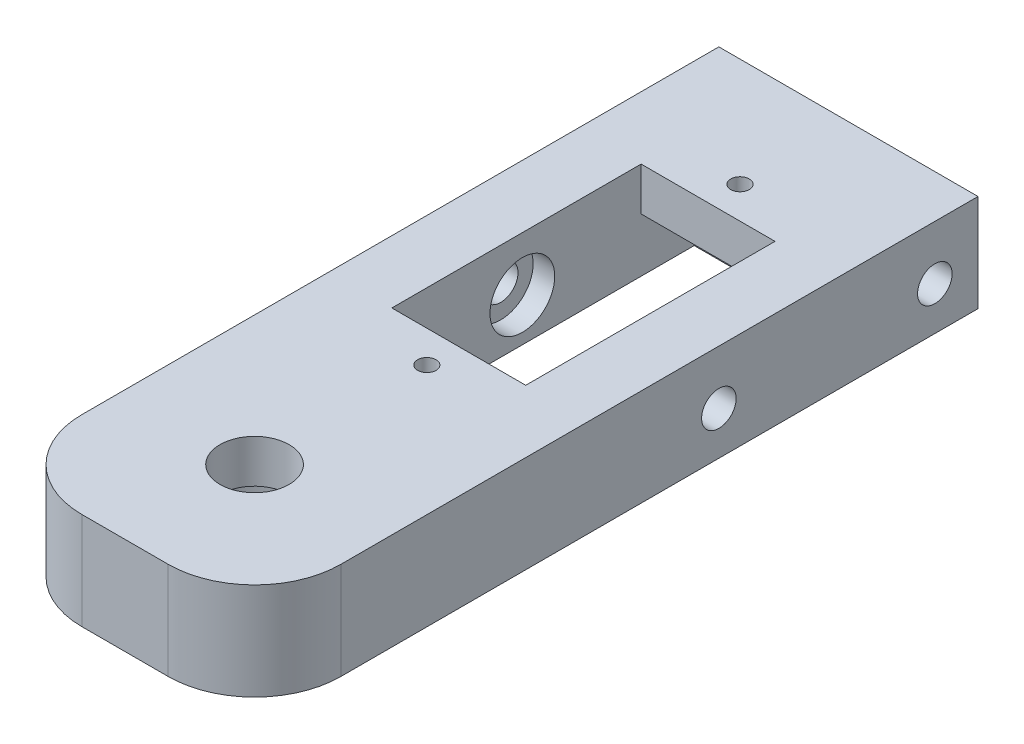
ISO-10303-21;
HEADER;
FILE_DESCRIPTION(('STEP AP214'),'2;1');
FILE_NAME('part.step','',(''),(''),'','','');
FILE_SCHEMA(('AUTOMOTIVE_DESIGN { 1 0 10303 214 1 1 1 1 }'));
ENDSEC;
DATA;
#1=APPLICATION_CONTEXT('core data for automotive mechanical design processes');
#2=APPLICATION_PROTOCOL_DEFINITION('international standard','automotive_design',2000,#1);
#3=PRODUCT_CONTEXT('',#1,'mechanical');
#4=PRODUCT('Part','Part','',(#3));
#5=PRODUCT_RELATED_PRODUCT_CATEGORY('part','',(#4));
#6=PRODUCT_DEFINITION_FORMATION('','',#4);
#7=PRODUCT_DEFINITION_CONTEXT('part definition',#1,'design');
#8=PRODUCT_DEFINITION('design','',#6,#7);
#9=PRODUCT_DEFINITION_SHAPE('','',#8);
#10=(LENGTH_UNIT() NAMED_UNIT(*) SI_UNIT(.MILLI.,.METRE.));
#11=(NAMED_UNIT(*) PLANE_ANGLE_UNIT() SI_UNIT($,.RADIAN.));
#12=(NAMED_UNIT(*) SI_UNIT($,.STERADIAN.) SOLID_ANGLE_UNIT());
#13=UNCERTAINTY_MEASURE_WITH_UNIT(LENGTH_MEASURE(1.E-05),#10,'distance_accuracy_value','');
#14=(GEOMETRIC_REPRESENTATION_CONTEXT(3) GLOBAL_UNCERTAINTY_ASSIGNED_CONTEXT((#13)) GLOBAL_UNIT_ASSIGNED_CONTEXT((#10,
#11,#12)) REPRESENTATION_CONTEXT('',''));
#15=CARTESIAN_POINT('',(0.,0.,0.));
#16=DIRECTION('',(0.,0.,1.));
#17=DIRECTION('',(1.,0.,0.));
#18=AXIS2_PLACEMENT_3D('',#15,#16,#17);
#19=CARTESIAN_POINT('',(-12.,0.,-31.0015722609013));
#20=DIRECTION('',(1.,0.,0.));
#21=DIRECTION('',(0.,0.,-1.));
#22=AXIS2_PLACEMENT_3D('',#19,#20,#21);
#23=CYLINDRICAL_SURFACE('',#22,1.60000000000001);
#24=CARTESIAN_POINT('',(12.,0.,-31.0015722609013));
#25=DIRECTION('',(1.,0.,0.));
#26=DIRECTION('',(0.,0.,-1.));
#27=AXIS2_PLACEMENT_3D('',#24,#25,#26);
#28=CIRCLE('',#27,1.60000000000001);
#29=CARTESIAN_POINT('',(12.,0.,-32.6015722609013));
#30=VERTEX_POINT('',#29);
#31=EDGE_CURVE('E262',#30,#30,#28,.T.);
#32=ORIENTED_EDGE('',*,*,#31,.T.);
#33=EDGE_LOOP('',(#32));
#34=FACE_BOUND('',#33,.T.);
#35=CARTESIAN_POINT('',(8.2,0.,-31.0015722609013));
#36=DIRECTION('',(-1.,0.,0.));
#37=DIRECTION('',(0.,0.,1.));
#38=AXIS2_PLACEMENT_3D('',#35,#36,#37);
#39=CIRCLE('',#38,1.60000000000001);
#40=CARTESIAN_POINT('',(8.2,0.,-29.4015722609013));
#41=VERTEX_POINT('',#40);
#42=EDGE_CURVE('E41',#41,#41,#39,.F.);
#43=ORIENTED_EDGE('',*,*,#42,.F.);
#44=EDGE_LOOP('',(#43));
#45=FACE_BOUND('',#44,.T.);
#46=ADVANCED_FACE('F37',(#34,#45),#23,.F.);
#47=CARTESIAN_POINT('',(-12.,0.,-31.0015722609013));
#48=DIRECTION('',(1.,0.,0.));
#49=DIRECTION('',(0.,0.,-1.));
#50=AXIS2_PLACEMENT_3D('',#47,#48,#49);
#51=CIRCLE('',#50,1.60000000000001);
#52=CARTESIAN_POINT('',(-12.,0.,-32.6015722609013));
#53=VERTEX_POINT('',#52);
#54=EDGE_CURVE('E267',#53,#53,#51,.T.);
#55=ORIENTED_EDGE('',*,*,#54,.F.);
#56=EDGE_LOOP('',(#55));
#57=FACE_BOUND('',#56,.T.);
#58=CARTESIAN_POINT('',(-8.2,0.,-31.0015722609013));
#59=DIRECTION('',(1.,0.,0.));
#60=DIRECTION('',(0.,0.,-1.));
#61=AXIS2_PLACEMENT_3D('',#58,#59,#60);
#62=CIRCLE('',#61,1.60000000000001);
#63=CARTESIAN_POINT('',(-8.2,0.,-32.6015722609013));
#64=VERTEX_POINT('',#63);
#65=EDGE_CURVE('E260',#64,#64,#62,.F.);
#66=ORIENTED_EDGE('',*,*,#65,.F.);
#67=EDGE_LOOP('',(#66));
#68=FACE_BOUND('',#67,.T.);
#69=ADVANCED_FACE('F339',(#57,#68),#23,.F.);
#70=CARTESIAN_POINT('',(6.2,-4.,-42.));
#71=DIRECTION('',(0.,0.,-1.));
#72=DIRECTION('',(0.,1.,0.));
#73=AXIS2_PLACEMENT_3D('',#70,#71,#72);
#74=PLANE('',#73);
#75=DIRECTION('',(-1.,0.,0.));
#76=VECTOR('',#75,1.);
#77=CARTESIAN_POINT('',(6.2,1.00000000000001,-42.));
#78=LINE('',#77,#76);
#79=CARTESIAN_POINT('',(6.2,1.00000000000001,-42.));
#80=VERTEX_POINT('',#79);
#81=CARTESIAN_POINT('',(-6.2,1.00000000000001,-42.));
#82=VERTEX_POINT('',#81);
#83=EDGE_CURVE('E189',#80,#82,#78,.T.);
#84=ORIENTED_EDGE('',*,*,#83,.F.);
#85=DIRECTION('',(0.,1.,0.));
#86=VECTOR('',#85,1.);
#87=CARTESIAN_POINT('',(6.2,-4.,-42.));
#88=LINE('',#87,#86);
#89=CARTESIAN_POINT('',(6.2,5.00000000000001,-42.));
#90=VERTEX_POINT('',#89);
#91=EDGE_CURVE('E207',#80,#90,#88,.T.);
#92=ORIENTED_EDGE('',*,*,#91,.T.);
#93=DIRECTION('',(-1.,0.,0.));
#94=VECTOR('',#93,1.);
#95=CARTESIAN_POINT('',(6.2,5.00000000000001,-42.));
#96=LINE('',#95,#94);
#97=CARTESIAN_POINT('',(-6.2,5.00000000000001,-42.));
#98=VERTEX_POINT('',#97);
#99=EDGE_CURVE('E156',#90,#98,#96,.T.);
#100=ORIENTED_EDGE('',*,*,#99,.T.);
#101=DIRECTION('',(0.,1.,0.));
#102=VECTOR('',#101,1.);
#103=CARTESIAN_POINT('',(-6.2,-4.,-42.));
#104=LINE('',#103,#102);
#105=EDGE_CURVE('E204',#82,#98,#104,.T.);
#106=ORIENTED_EDGE('',*,*,#105,.F.);
#107=EDGE_LOOP('',(#84,#92,#100,#106));
#108=FACE_BOUND('',#107,.T.);
#109=ADVANCED_FACE('F308',(#108),#74,.F.);
#110=CARTESIAN_POINT('',(6.2,-4.00000000000001,-18.9147427120666));
#111=DIRECTION('',(0.,0.,1.));
#112=DIRECTION('',(0.,-1.,0.));
#113=AXIS2_PLACEMENT_3D('',#110,#111,#112);
#114=PLANE('',#113);
#115=DIRECTION('',(1.,0.,0.));
#116=VECTOR('',#115,1.);
#117=CARTESIAN_POINT('',(6.2,1.00000000000001,-18.9147427120666));
#118=LINE('',#117,#116);
#119=CARTESIAN_POINT('',(-6.2,1.00000000000001,-18.9147427120666));
#120=VERTEX_POINT('',#119);
#121=CARTESIAN_POINT('',(6.2,1.,-18.9147427120666));
#122=VERTEX_POINT('',#121);
#123=EDGE_CURVE('E247',#120,#122,#118,.T.);
#124=ORIENTED_EDGE('',*,*,#123,.F.);
#125=DIRECTION('',(0.,1.,0.));
#126=VECTOR('',#125,1.);
#127=CARTESIAN_POINT('',(-6.2,-4.00000000000001,-18.9147427120666));
#128=LINE('',#127,#126);
#129=CARTESIAN_POINT('',(-6.19999999999999,5.00000000000001,-18.9147427120666));
#130=VERTEX_POINT('',#129);
#131=EDGE_CURVE('E193',#120,#130,#128,.T.);
#132=ORIENTED_EDGE('',*,*,#131,.T.);
#133=DIRECTION('',(1.,0.,0.));
#134=VECTOR('',#133,1.);
#135=CARTESIAN_POINT('',(6.2,5.,-18.9147427120666));
#136=LINE('',#135,#134);
#137=CARTESIAN_POINT('',(6.2,5.,-18.9147427120666));
#138=VERTEX_POINT('',#137);
#139=EDGE_CURVE('E196',#130,#138,#136,.T.);
#140=ORIENTED_EDGE('',*,*,#139,.T.);
#141=DIRECTION('',(0.,1.,0.));
#142=VECTOR('',#141,1.);
#143=CARTESIAN_POINT('',(6.2,-4.00000000000001,-18.9147427120666));
#144=LINE('',#143,#142);
#145=EDGE_CURVE('E209',#122,#138,#144,.T.);
#146=ORIENTED_EDGE('',*,*,#145,.F.);
#147=EDGE_LOOP('',(#124,#132,#140,#146));
#148=FACE_BOUND('',#147,.T.);
#149=ADVANCED_FACE('F319',(#148),#114,.F.);
#150=CARTESIAN_POINT('',(12.,-4.,12.));
#151=DIRECTION('',(0.,0.,-1.));
#152=DIRECTION('',(0.,1.,0.));
#153=AXIS2_PLACEMENT_3D('',#150,#151,#152);
#154=PLANE('',#153);
#155=DIRECTION('',(-1.,0.,0.));
#156=VECTOR('',#155,1.);
#157=CARTESIAN_POINT('',(12.,5.,12.));
#158=LINE('',#157,#156);
#159=CARTESIAN_POINT('',(4.,5.,12.));
#160=VERTEX_POINT('',#159);
#161=CARTESIAN_POINT('',(-4.,5.,12.));
#162=VERTEX_POINT('',#161);
#163=EDGE_CURVE('E231',#160,#162,#158,.T.);
#164=ORIENTED_EDGE('',*,*,#163,.T.);
#165=DIRECTION('',(0.,-1.,0.));
#166=VECTOR('',#165,1.);
#167=CARTESIAN_POINT('',(-4.,-4.,12.));
#168=LINE('',#167,#166);
#169=CARTESIAN_POINT('',(-4.,-4.,12.));
#170=VERTEX_POINT('',#169);
#171=EDGE_CURVE('E251',#162,#170,#168,.T.);
#172=ORIENTED_EDGE('',*,*,#171,.T.);
#173=DIRECTION('',(-1.,0.,0.));
#174=VECTOR('',#173,1.);
#175=CARTESIAN_POINT('',(12.,-4.,12.));
#176=LINE('',#175,#174);
#177=CARTESIAN_POINT('',(4.,-4.,12.));
#178=VERTEX_POINT('',#177);
#179=EDGE_CURVE('E244',#178,#170,#176,.T.);
#180=ORIENTED_EDGE('',*,*,#179,.F.);
#181=DIRECTION('',(0.,-1.,0.));
#182=VECTOR('',#181,1.);
#183=CARTESIAN_POINT('',(4.,5.,12.));
#184=LINE('',#183,#182);
#185=EDGE_CURVE('E249',#178,#160,#184,.F.);
#186=ORIENTED_EDGE('',*,*,#185,.T.);
#187=EDGE_LOOP('',(#164,#172,#180,#186));
#188=FACE_BOUND('',#187,.T.);
#189=ADVANCED_FACE('F384',(#188),#154,.F.);
#190=CARTESIAN_POINT('',(12.,-3.99999999999999,-55.));
#191=DIRECTION('',(0.,1.,0.));
#192=DIRECTION('',(0.,0.,1.));
#193=AXIS2_PLACEMENT_3D('',#190,#191,#192);
#194=PLANE('',#193);
#195=DIRECTION('',(0.,0.,1.));
#196=VECTOR('',#195,1.);
#197=CARTESIAN_POINT('',(-6.2,-4.,-42.));
#198=LINE('',#197,#196);
#199=CARTESIAN_POINT('',(-6.2,-3.99999999999999,-46.9147427120666));
#200=VERTEX_POINT('',#199);
#201=CARTESIAN_POINT('',(-6.2,-4.,-14.));
#202=VERTEX_POINT('',#201);
#203=EDGE_CURVE('E144',#200,#202,#198,.T.);
#204=ORIENTED_EDGE('',*,*,#203,.T.);
#205=DIRECTION('',(-1.,0.,0.));
#206=VECTOR('',#205,1.);
#207=CARTESIAN_POINT('',(6.2,-4.,-14.));
#208=LINE('',#207,#206);
#209=CARTESIAN_POINT('',(6.2,-4.,-14.));
#210=VERTEX_POINT('',#209);
#211=EDGE_CURVE('E167',#210,#202,#208,.T.);
#212=ORIENTED_EDGE('',*,*,#211,.F.);
#213=DIRECTION('',(0.,0.,-1.));
#214=VECTOR('',#213,1.);
#215=CARTESIAN_POINT('',(6.2,-4.,-42.));
#216=LINE('',#215,#214);
#217=CARTESIAN_POINT('',(6.2,-3.99999999999999,-46.9147427120666));
#218=VERTEX_POINT('',#217);
#219=EDGE_CURVE('E155',#210,#218,#216,.T.);
#220=ORIENTED_EDGE('',*,*,#219,.T.);
#221=DIRECTION('',(1.,0.,0.));
#222=VECTOR('',#221,1.);
#223=CARTESIAN_POINT('',(6.2,-3.99999999999999,-46.9147427120666));
#224=LINE('',#223,#222);
#225=EDGE_CURVE('E162',#200,#218,#224,.T.);
#226=ORIENTED_EDGE('',*,*,#225,.F.);
#227=EDGE_LOOP('',(#204,#212,#220,#226));
#228=FACE_BOUND('',#227,.T.);
#229=CARTESIAN_POINT('',(0.,-4.,0.));
#230=DIRECTION('',(0.,1.,0.));
#231=DIRECTION('',(0.,0.,1.));
#232=AXIS2_PLACEMENT_3D('',#229,#230,#231);
#233=CIRCLE('',#232,6.7);
#234=CARTESIAN_POINT('',(0.,-4.,6.7));
#235=VERTEX_POINT('',#234);
#236=EDGE_CURVE('E215',#235,#235,#233,.T.);
#237=ORIENTED_EDGE('',*,*,#236,.T.);
#238=EDGE_LOOP('',(#237));
#239=FACE_BOUND('',#238,.T.);
#240=ORIENTED_EDGE('',*,*,#179,.T.);
#241=CARTESIAN_POINT('',(-4.,-4.,4.));
#242=DIRECTION('',(0.,1.,0.));
#243=DIRECTION('',(0.,0.,1.));
#244=AXIS2_PLACEMENT_3D('',#241,#242,#243);
#245=CIRCLE('',#244,8.);
#246=CARTESIAN_POINT('',(-12.,-4.,4.));
#247=VERTEX_POINT('',#246);
#248=EDGE_CURVE('E256',#170,#247,#245,.F.);
#249=ORIENTED_EDGE('',*,*,#248,.T.);
#250=DIRECTION('',(0.,0.,-1.));
#251=VECTOR('',#250,1.);
#252=CARTESIAN_POINT('',(-12.,-3.99999999999999,-55.));
#253=LINE('',#252,#251);
#254=CARTESIAN_POINT('',(-12.,-3.99999999999999,-55.));
#255=VERTEX_POINT('',#254);
#256=EDGE_CURVE('E221',#247,#255,#253,.T.);
#257=ORIENTED_EDGE('',*,*,#256,.T.);
#258=DIRECTION('',(-1.,0.,0.));
#259=VECTOR('',#258,1.);
#260=CARTESIAN_POINT('',(12.,-3.99999999999999,-55.));
#261=LINE('',#260,#259);
#262=CARTESIAN_POINT('',(12.,-3.99999999999999,-55.));
#263=VERTEX_POINT('',#262);
#264=EDGE_CURVE('E241',#263,#255,#261,.T.);
#265=ORIENTED_EDGE('',*,*,#264,.F.);
#266=DIRECTION('',(0.,0.,-1.));
#267=VECTOR('',#266,1.);
#268=CARTESIAN_POINT('',(12.,-3.99999999999999,-55.));
#269=LINE('',#268,#267);
#270=CARTESIAN_POINT('',(12.,-4.,4.));
#271=VERTEX_POINT('',#270);
#272=EDGE_CURVE('E224',#271,#263,#269,.T.);
#273=ORIENTED_EDGE('',*,*,#272,.F.);
#274=CARTESIAN_POINT('',(4.,-4.,4.));
#275=DIRECTION('',(0.,1.,0.));
#276=DIRECTION('',(0.,0.,1.));
#277=AXIS2_PLACEMENT_3D('',#274,#275,#276);
#278=CIRCLE('',#277,8.);
#279=EDGE_CURVE('E254',#271,#178,#278,.F.);
#280=ORIENTED_EDGE('',*,*,#279,.T.);
#281=EDGE_LOOP('',(#240,#249,#257,#265,#273,#280));
#282=FACE_BOUND('',#281,.T.);
#283=ADVANCED_FACE('F169',(#228,#239,#282),#194,.F.);
#284=CARTESIAN_POINT('',(12.,-3.99999999999999,-55.));
#285=DIRECTION('',(0.,0.,1.));
#286=DIRECTION('',(1.,0.,0.));
#287=AXIS2_PLACEMENT_3D('',#284,#285,#286);
#288=PLANE('',#287);
#289=DIRECTION('',(0.,1.,0.));
#290=VECTOR('',#289,1.);
#291=CARTESIAN_POINT('',(-12.,-3.99999999999999,-55.));
#292=LINE('',#291,#290);
#293=CARTESIAN_POINT('',(-12.,5.00000000000001,-55.));
#294=VERTEX_POINT('',#293);
#295=EDGE_CURVE('E233',#255,#294,#292,.T.);
#296=ORIENTED_EDGE('',*,*,#295,.T.);
#297=DIRECTION('',(-1.,0.,0.));
#298=VECTOR('',#297,1.);
#299=CARTESIAN_POINT('',(12.,5.00000000000001,-55.));
#300=LINE('',#299,#298);
#301=CARTESIAN_POINT('',(12.,5.00000000000001,-55.));
#302=VERTEX_POINT('',#301);
#303=EDGE_CURVE('E238',#302,#294,#300,.T.);
#304=ORIENTED_EDGE('',*,*,#303,.F.);
#305=DIRECTION('',(0.,1.,0.));
#306=VECTOR('',#305,1.);
#307=CARTESIAN_POINT('',(12.,-3.99999999999999,-55.));
#308=LINE('',#307,#306);
#309=EDGE_CURVE('E226',#263,#302,#308,.T.);
#310=ORIENTED_EDGE('',*,*,#309,.F.);
#311=ORIENTED_EDGE('',*,*,#264,.T.);
#312=EDGE_LOOP('',(#296,#304,#310,#311));
#313=FACE_BOUND('',#312,.T.);
#314=ADVANCED_FACE('F368',(#313),#288,.F.);
#315=CARTESIAN_POINT('',(12.,5.00000000000001,-55.));
#316=DIRECTION('',(0.,-1.,0.));
#317=DIRECTION('',(0.,0.,-1.));
#318=AXIS2_PLACEMENT_3D('',#315,#316,#317);
#319=PLANE('',#318);
#320=CARTESIAN_POINT('',(0.,5.00000000000002,-15.9573713560333));
#321=DIRECTION('',(0.,-1.,0.));
#322=DIRECTION('',(0.,0.,-1.));
#323=AXIS2_PLACEMENT_3D('',#320,#321,#322);
#324=CIRCLE('',#323,0.855484328760497);
#325=CARTESIAN_POINT('',(0.,5.00000000000002,-16.8128556847938));
#326=VERTEX_POINT('',#325);
#327=EDGE_CURVE('E172',#326,#326,#324,.T.);
#328=ORIENTED_EDGE('',*,*,#327,.T.);
#329=EDGE_LOOP('',(#328));
#330=FACE_BOUND('',#329,.T.);
#331=CARTESIAN_POINT('',(0.,5.00000000000002,-44.9573713560333));
#332=DIRECTION('',(0.,-1.,0.));
#333=DIRECTION('',(0.,0.,1.));
#334=AXIS2_PLACEMENT_3D('',#331,#332,#333);
#335=CIRCLE('',#334,0.855484328760494);
#336=CARTESIAN_POINT('',(0.,5.00000000000002,-44.1018870272728));
#337=VERTEX_POINT('',#336);
#338=EDGE_CURVE('E291',#337,#337,#335,.T.);
#339=ORIENTED_EDGE('',*,*,#338,.T.);
#340=EDGE_LOOP('',(#339));
#341=FACE_BOUND('',#340,.T.);
#342=ORIENTED_EDGE('',*,*,#139,.F.);
#343=DIRECTION('',(0.,0.,1.));
#344=VECTOR('',#343,1.);
#345=CARTESIAN_POINT('',(-6.2,5.00000000000001,-42.));
#346=LINE('',#345,#344);
#347=EDGE_CURVE('E190',#98,#130,#346,.T.);
#348=ORIENTED_EDGE('',*,*,#347,.F.);
#349=ORIENTED_EDGE('',*,*,#99,.F.);
#350=DIRECTION('',(0.,0.,-1.));
#351=VECTOR('',#350,1.);
#352=CARTESIAN_POINT('',(6.2,5.00000000000001,-42.));
#353=LINE('',#352,#351);
#354=EDGE_CURVE('E199',#138,#90,#353,.T.);
#355=ORIENTED_EDGE('',*,*,#354,.F.);
#356=EDGE_LOOP('',(#342,#348,#349,#355));
#357=FACE_BOUND('',#356,.T.);
#358=CARTESIAN_POINT('',(0.,5.00000000000001,0.));
#359=DIRECTION('',(0.,-1.,0.));
#360=DIRECTION('',(0.,0.,-1.));
#361=AXIS2_PLACEMENT_3D('',#358,#359,#360);
#362=CIRCLE('',#361,3.2);
#363=CARTESIAN_POINT('',(0.,5.00000000000001,-3.2));
#364=VERTEX_POINT('',#363);
#365=EDGE_CURVE('E212',#364,#364,#362,.T.);
#366=ORIENTED_EDGE('',*,*,#365,.T.);
#367=EDGE_LOOP('',(#366));
#368=FACE_BOUND('',#367,.T.);
#369=DIRECTION('',(0.,0.,1.));
#370=VECTOR('',#369,1.);
#371=CARTESIAN_POINT('',(-12.,5.00000000000001,-55.));
#372=LINE('',#371,#370);
#373=CARTESIAN_POINT('',(-12.,5.,4.));
#374=VERTEX_POINT('',#373);
#375=EDGE_CURVE('E227',#294,#374,#372,.T.);
#376=ORIENTED_EDGE('',*,*,#375,.T.);
#377=CARTESIAN_POINT('',(-4.,5.,4.));
#378=DIRECTION('',(0.,-1.,0.));
#379=DIRECTION('',(0.,0.,-1.));
#380=AXIS2_PLACEMENT_3D('',#377,#378,#379);
#381=CIRCLE('',#380,8.);
#382=EDGE_CURVE('E46',#374,#162,#381,.F.);
#383=ORIENTED_EDGE('',*,*,#382,.T.);
#384=ORIENTED_EDGE('',*,*,#163,.F.);
#385=CARTESIAN_POINT('',(4.,5.,4.));
#386=DIRECTION('',(0.,-1.,0.));
#387=DIRECTION('',(0.,0.,-1.));
#388=AXIS2_PLACEMENT_3D('',#385,#386,#387);
#389=CIRCLE('',#388,8.);
#390=CARTESIAN_POINT('',(12.,5.,4.));
#391=VERTEX_POINT('',#390);
#392=EDGE_CURVE('E54',#160,#391,#389,.F.);
#393=ORIENTED_EDGE('',*,*,#392,.T.);
#394=DIRECTION('',(0.,0.,1.));
#395=VECTOR('',#394,1.);
#396=CARTESIAN_POINT('',(12.,5.00000000000001,-55.));
#397=LINE('',#396,#395);
#398=EDGE_CURVE('E229',#302,#391,#397,.T.);
#399=ORIENTED_EDGE('',*,*,#398,.F.);
#400=ORIENTED_EDGE('',*,*,#303,.T.);
#401=EDGE_LOOP('',(#376,#383,#384,#393,#399,#400));
#402=FACE_BOUND('',#401,.T.);
#403=ADVANCED_FACE('F315',(#330,#341,#357,#368,#402),#319,.F.);
#404=CARTESIAN_POINT('',(12.,0.,0.));
#405=DIRECTION('',(1.,0.,0.));
#406=DIRECTION('',(0.,0.,-1.));
#407=AXIS2_PLACEMENT_3D('',#404,#405,#406);
#408=PLANE('',#407);
#409=CARTESIAN_POINT('',(12.,0.,-51.0015722609013));
#410=DIRECTION('',(1.,0.,0.));
#411=DIRECTION('',(0.,0.,-1.));
#412=AXIS2_PLACEMENT_3D('',#409,#410,#411);
#413=CIRCLE('',#412,1.6);
#414=CARTESIAN_POINT('',(12.,0.,-52.6015722609013));
#415=VERTEX_POINT('',#414);
#416=EDGE_CURVE('E284',#415,#415,#413,.T.);
#417=ORIENTED_EDGE('',*,*,#416,.F.);
#418=EDGE_LOOP('',(#417));
#419=FACE_BOUND('',#418,.T.);
#420=ORIENTED_EDGE('',*,*,#31,.F.);
#421=EDGE_LOOP('',(#420));
#422=FACE_BOUND('',#421,.T.);
#423=ORIENTED_EDGE('',*,*,#398,.T.);
#424=DIRECTION('',(0.,-1.,0.));
#425=VECTOR('',#424,1.);
#426=CARTESIAN_POINT('',(12.,-4.,4.));
#427=LINE('',#426,#425);
#428=EDGE_CURVE('E12',#391,#271,#427,.T.);
#429=ORIENTED_EDGE('',*,*,#428,.T.);
#430=ORIENTED_EDGE('',*,*,#272,.T.);
#431=ORIENTED_EDGE('',*,*,#309,.T.);
#432=EDGE_LOOP('',(#423,#429,#430,#431));
#433=FACE_BOUND('',#432,.T.);
#434=ADVANCED_FACE('F367',(#419,#422,#433),#408,.T.);
#435=CARTESIAN_POINT('',(-12.,0.,0.));
#436=DIRECTION('',(1.,0.,0.));
#437=DIRECTION('',(0.,0.,-1.));
#438=AXIS2_PLACEMENT_3D('',#435,#436,#437);
#439=PLANE('',#438);
#440=CARTESIAN_POINT('',(-12.,0.,-51.0015722609013));
#441=DIRECTION('',(1.,0.,0.));
#442=DIRECTION('',(0.,0.,-1.));
#443=AXIS2_PLACEMENT_3D('',#440,#441,#442);
#444=CIRCLE('',#443,1.6);
#445=CARTESIAN_POINT('',(-12.,0.,-52.6015722609013));
#446=VERTEX_POINT('',#445);
#447=EDGE_CURVE('E280',#446,#446,#444,.T.);
#448=ORIENTED_EDGE('',*,*,#447,.T.);
#449=EDGE_LOOP('',(#448));
#450=FACE_BOUND('',#449,.T.);
#451=ORIENTED_EDGE('',*,*,#54,.T.);
#452=EDGE_LOOP('',(#451));
#453=FACE_BOUND('',#452,.T.);
#454=ORIENTED_EDGE('',*,*,#256,.F.);
#455=DIRECTION('',(0.,-1.,0.));
#456=VECTOR('',#455,1.);
#457=CARTESIAN_POINT('',(-12.,0.,4.));
#458=LINE('',#457,#456);
#459=EDGE_CURVE('E62',#247,#374,#458,.F.);
#460=ORIENTED_EDGE('',*,*,#459,.T.);
#461=ORIENTED_EDGE('',*,*,#375,.F.);
#462=ORIENTED_EDGE('',*,*,#295,.F.);
#463=EDGE_LOOP('',(#454,#460,#461,#462));
#464=FACE_BOUND('',#463,.T.);
#465=ADVANCED_FACE('F375',(#450,#453,#464),#439,.F.);
#466=CARTESIAN_POINT('',(0.,1.,0.));
#467=DIRECTION('',(0.,-1.,0.));
#468=DIRECTION('',(0.,0.,-1.));
#469=AXIS2_PLACEMENT_3D('',#466,#467,#468);
#470=CYLINDRICAL_SURFACE('',#469,6.7);
#471=CARTESIAN_POINT('',(0.,1.,0.));
#472=DIRECTION('',(0.,1.,0.));
#473=DIRECTION('',(0.,0.,1.));
#474=AXIS2_PLACEMENT_3D('',#471,#472,#473);
#475=CIRCLE('',#474,6.7);
#476=CARTESIAN_POINT('',(0.,1.,6.7));
#477=VERTEX_POINT('',#476);
#478=EDGE_CURVE('E218',#477,#477,#475,.T.);
#479=ORIENTED_EDGE('',*,*,#478,.T.);
#480=EDGE_LOOP('',(#479));
#481=FACE_BOUND('',#480,.T.);
#482=ORIENTED_EDGE('',*,*,#236,.F.);
#483=EDGE_LOOP('',(#482));
#484=FACE_BOUND('',#483,.T.);
#485=ADVANCED_FACE('F406',(#481,#484),#470,.F.);
#486=CARTESIAN_POINT('',(0.,1.,0.));
#487=DIRECTION('',(0.,1.,0.));
#488=DIRECTION('',(0.,0.,1.));
#489=AXIS2_PLACEMENT_3D('',#486,#487,#488);
#490=PLANE('',#489);
#491=CARTESIAN_POINT('',(0.,1.,0.));
#492=DIRECTION('',(0.,-1.,0.));
#493=DIRECTION('',(0.,0.,-1.));
#494=AXIS2_PLACEMENT_3D('',#491,#492,#493);
#495=CIRCLE('',#494,3.2);
#496=CARTESIAN_POINT('',(0.,1.,-3.2));
#497=VERTEX_POINT('',#496);
#498=EDGE_CURVE('E206',#497,#497,#495,.T.);
#499=ORIENTED_EDGE('',*,*,#498,.F.);
#500=EDGE_LOOP('',(#499));
#501=FACE_BOUND('',#500,.T.);
#502=ORIENTED_EDGE('',*,*,#478,.F.);
#503=EDGE_LOOP('',(#502));
#504=FACE_BOUND('',#503,.T.);
#505=ADVANCED_FACE('F411',(#501,#504),#490,.F.);
#506=CARTESIAN_POINT('',(0.,5.00000000000001,0.));
#507=DIRECTION('',(0.,-1.,0.));
#508=DIRECTION('',(0.,0.,-1.));
#509=AXIS2_PLACEMENT_3D('',#506,#507,#508);
#510=CYLINDRICAL_SURFACE('',#509,3.2);
#511=ORIENTED_EDGE('',*,*,#365,.F.);
#512=EDGE_LOOP('',(#511));
#513=FACE_BOUND('',#512,.T.);
#514=ORIENTED_EDGE('',*,*,#498,.T.);
#515=EDGE_LOOP('',(#514));
#516=FACE_BOUND('',#515,.T.);
#517=ADVANCED_FACE('F459',(#513,#516),#510,.F.);
#518=CARTESIAN_POINT('',(-6.2,-4.,-42.));
#519=DIRECTION('',(-1.,0.,0.));
#520=DIRECTION('',(0.,0.,1.));
#521=AXIS2_PLACEMENT_3D('',#518,#519,#520);
#522=PLANE('',#521);
#523=CARTESIAN_POINT('',(-6.2,0.,-31.0015722609013));
#524=DIRECTION('',(1.,0.,0.));
#525=DIRECTION('',(0.,0.,-1.));
#526=AXIS2_PLACEMENT_3D('',#523,#524,#525);
#527=CIRCLE('',#526,3.);
#528=CARTESIAN_POINT('',(-6.2,0.,-34.0015722609013));
#529=VERTEX_POINT('',#528);
#530=EDGE_CURVE('E270',#529,#529,#527,.T.);
#531=ORIENTED_EDGE('',*,*,#530,.F.);
#532=EDGE_LOOP('',(#531));
#533=FACE_BOUND('',#532,.T.);
#534=ORIENTED_EDGE('',*,*,#203,.F.);
#535=DIRECTION('',(0.,-1.,0.));
#536=VECTOR('',#535,1.);
#537=CARTESIAN_POINT('',(-6.2,40.1730051005248,-46.9147427120666));
#538=LINE('',#537,#536);
#539=CARTESIAN_POINT('',(-6.2,1.00000000000001,-46.9147427120666));
#540=VERTEX_POINT('',#539);
#541=EDGE_CURVE('E148',#540,#200,#538,.T.);
#542=ORIENTED_EDGE('',*,*,#541,.F.);
#543=DIRECTION('',(0.,0.,1.));
#544=VECTOR('',#543,1.);
#545=CARTESIAN_POINT('',(-6.2,1.00000000000001,-46.9147427120666));
#546=LINE('',#545,#544);
#547=EDGE_CURVE('E179',#540,#82,#546,.T.);
#548=ORIENTED_EDGE('',*,*,#547,.T.);
#549=ORIENTED_EDGE('',*,*,#105,.T.);
#550=ORIENTED_EDGE('',*,*,#347,.T.);
#551=ORIENTED_EDGE('',*,*,#131,.F.);
#552=CARTESIAN_POINT('',(-6.2,1.,-14.));
#553=VERTEX_POINT('',#552);
#554=EDGE_CURVE('E299',#120,#553,#546,.T.);
#555=ORIENTED_EDGE('',*,*,#554,.T.);
#556=DIRECTION('',(0.,-1.,0.));
#557=VECTOR('',#556,1.);
#558=CARTESIAN_POINT('',(-6.2,40.1730051005248,-14.));
#559=LINE('',#558,#557);
#560=EDGE_CURVE('E150',#553,#202,#559,.T.);
#561=ORIENTED_EDGE('',*,*,#560,.T.);
#562=EDGE_LOOP('',(#534,#542,#548,#549,#550,#551,#555,#561));
#563=FACE_BOUND('',#562,.T.);
#564=ADVANCED_FACE('F146',(#533,#563),#522,.F.);
#565=CARTESIAN_POINT('',(6.2,-4.,-42.));
#566=DIRECTION('',(1.,0.,0.));
#567=DIRECTION('',(0.,0.,-1.));
#568=AXIS2_PLACEMENT_3D('',#565,#566,#567);
#569=PLANE('',#568);
#570=CARTESIAN_POINT('',(6.2,0.,-31.0015722609013));
#571=DIRECTION('',(1.,0.,0.));
#572=DIRECTION('',(0.,0.,-1.));
#573=AXIS2_PLACEMENT_3D('',#570,#571,#572);
#574=CIRCLE('',#573,3.);
#575=CARTESIAN_POINT('',(6.2,0.,-34.0015722609013));
#576=VERTEX_POINT('',#575);
#577=EDGE_CURVE('E277',#576,#576,#574,.T.);
#578=ORIENTED_EDGE('',*,*,#577,.T.);
#579=EDGE_LOOP('',(#578));
#580=FACE_BOUND('',#579,.T.);
#581=ORIENTED_EDGE('',*,*,#219,.F.);
#582=DIRECTION('',(0.,-1.,0.));
#583=VECTOR('',#582,1.);
#584=CARTESIAN_POINT('',(6.2,40.1730051005248,-14.));
#585=LINE('',#584,#583);
#586=CARTESIAN_POINT('',(6.2,1.,-14.));
#587=VERTEX_POINT('',#586);
#588=EDGE_CURVE('E184',#587,#210,#585,.T.);
#589=ORIENTED_EDGE('',*,*,#588,.F.);
#590=DIRECTION('',(0.,0.,-1.));
#591=VECTOR('',#590,1.);
#592=CARTESIAN_POINT('',(6.2,1.00000000000001,-46.9147427120666));
#593=LINE('',#592,#591);
#594=EDGE_CURVE('E296',#587,#122,#593,.T.);
#595=ORIENTED_EDGE('',*,*,#594,.T.);
#596=ORIENTED_EDGE('',*,*,#145,.T.);
#597=ORIENTED_EDGE('',*,*,#354,.T.);
#598=ORIENTED_EDGE('',*,*,#91,.F.);
#599=CARTESIAN_POINT('',(6.2,1.00000000000001,-46.9147427120666));
#600=VERTEX_POINT('',#599);
#601=EDGE_CURVE('E183',#80,#600,#593,.T.);
#602=ORIENTED_EDGE('',*,*,#601,.T.);
#603=DIRECTION('',(0.,-1.,0.));
#604=VECTOR('',#603,1.);
#605=CARTESIAN_POINT('',(6.2,40.1730051005248,-46.9147427120666));
#606=LINE('',#605,#604);
#607=EDGE_CURVE('E166',#600,#218,#606,.T.);
#608=ORIENTED_EDGE('',*,*,#607,.T.);
#609=EDGE_LOOP('',(#581,#589,#595,#596,#597,#598,#602,#608));
#610=FACE_BOUND('',#609,.T.);
#611=ADVANCED_FACE('F325',(#580,#610),#569,.F.);
#612=CARTESIAN_POINT('',(12.,1.00000000000001,-55.));
#613=DIRECTION('',(0.,-1.,0.));
#614=DIRECTION('',(0.,0.,-1.));
#615=AXIS2_PLACEMENT_3D('',#612,#613,#614);
#616=PLANE('',#615);
#617=CARTESIAN_POINT('',(0.,1.,-15.9573713560333));
#618=DIRECTION('',(0.,-1.,0.));
#619=DIRECTION('',(0.,0.,-1.));
#620=AXIS2_PLACEMENT_3D('',#617,#618,#619);
#621=CIRCLE('',#620,0.855484328760497);
#622=CARTESIAN_POINT('',(0.,1.,-16.8128556847938));
#623=VERTEX_POINT('',#622);
#624=EDGE_CURVE('E176',#623,#623,#621,.T.);
#625=ORIENTED_EDGE('',*,*,#624,.F.);
#626=EDGE_LOOP('',(#625));
#627=FACE_BOUND('',#626,.T.);
#628=ORIENTED_EDGE('',*,*,#123,.T.);
#629=ORIENTED_EDGE('',*,*,#594,.F.);
#630=DIRECTION('',(1.,0.,0.));
#631=VECTOR('',#630,1.);
#632=CARTESIAN_POINT('',(6.2,1.,-14.));
#633=LINE('',#632,#631);
#634=EDGE_CURVE('E298',#553,#587,#633,.T.);
#635=ORIENTED_EDGE('',*,*,#634,.F.);
#636=ORIENTED_EDGE('',*,*,#554,.F.);
#637=EDGE_LOOP('',(#628,#629,#635,#636));
#638=FACE_BOUND('',#637,.T.);
#639=ADVANCED_FACE('F322',(#627,#638),#616,.T.);
#640=CARTESIAN_POINT('',(6.2,40.1730051005248,-14.));
#641=DIRECTION('',(0.,0.,1.));
#642=DIRECTION('',(0.,-1.,0.));
#643=AXIS2_PLACEMENT_3D('',#640,#641,#642);
#644=PLANE('',#643);
#645=ORIENTED_EDGE('',*,*,#634,.T.);
#646=ORIENTED_EDGE('',*,*,#588,.T.);
#647=ORIENTED_EDGE('',*,*,#211,.T.);
#648=ORIENTED_EDGE('',*,*,#560,.F.);
#649=EDGE_LOOP('',(#645,#646,#647,#648));
#650=FACE_BOUND('',#649,.T.);
#651=ADVANCED_FACE('F326',(#650),#644,.F.);
#652=CARTESIAN_POINT('',(0.,1.00000000000001,-44.9573713560333));
#653=DIRECTION('',(0.,-1.,0.));
#654=DIRECTION('',(0.,0.,1.));
#655=AXIS2_PLACEMENT_3D('',#652,#653,#654);
#656=CIRCLE('',#655,0.855484328760494);
#657=CARTESIAN_POINT('',(0.,1.00000000000001,-44.1018870272728));
#658=VERTEX_POINT('',#657);
#659=EDGE_CURVE('E283',#658,#658,#656,.T.);
#660=ORIENTED_EDGE('',*,*,#659,.F.);
#661=EDGE_LOOP('',(#660));
#662=FACE_BOUND('',#661,.T.);
#663=ORIENTED_EDGE('',*,*,#83,.T.);
#664=ORIENTED_EDGE('',*,*,#547,.F.);
#665=DIRECTION('',(-1.,0.,0.));
#666=VECTOR('',#665,1.);
#667=CARTESIAN_POINT('',(6.2,1.00000000000001,-46.9147427120666));
#668=LINE('',#667,#666);
#669=EDGE_CURVE('E164',#600,#540,#668,.T.);
#670=ORIENTED_EDGE('',*,*,#669,.F.);
#671=ORIENTED_EDGE('',*,*,#601,.F.);
#672=EDGE_LOOP('',(#663,#664,#670,#671));
#673=FACE_BOUND('',#672,.T.);
#674=ADVANCED_FACE('F328',(#662,#673),#616,.T.);
#675=CARTESIAN_POINT('',(6.2,40.1730051005248,-46.9147427120666));
#676=DIRECTION('',(0.,0.,-1.));
#677=DIRECTION('',(0.,1.,0.));
#678=AXIS2_PLACEMENT_3D('',#675,#676,#677);
#679=PLANE('',#678);
#680=ORIENTED_EDGE('',*,*,#669,.T.);
#681=ORIENTED_EDGE('',*,*,#541,.T.);
#682=ORIENTED_EDGE('',*,*,#225,.T.);
#683=ORIENTED_EDGE('',*,*,#607,.F.);
#684=EDGE_LOOP('',(#680,#681,#682,#683));
#685=FACE_BOUND('',#684,.T.);
#686=ADVANCED_FACE('F160',(#685),#679,.F.);
#687=CARTESIAN_POINT('',(0.,5.00000000000002,-44.9573713560333));
#688=DIRECTION('',(0.,-1.,0.));
#689=DIRECTION('',(0.,0.,-1.));
#690=AXIS2_PLACEMENT_3D('',#687,#688,#689);
#691=CYLINDRICAL_SURFACE('',#690,0.855484328760494);
#692=ORIENTED_EDGE('',*,*,#338,.F.);
#693=EDGE_LOOP('',(#692));
#694=FACE_BOUND('',#693,.T.);
#695=ORIENTED_EDGE('',*,*,#659,.T.);
#696=EDGE_LOOP('',(#695));
#697=FACE_BOUND('',#696,.T.);
#698=ADVANCED_FACE('F355',(#694,#697),#691,.F.);
#699=CARTESIAN_POINT('',(0.,5.00000000000002,-15.9573713560333));
#700=DIRECTION('',(0.,-1.,0.));
#701=DIRECTION('',(0.,0.,-1.));
#702=AXIS2_PLACEMENT_3D('',#699,#700,#701);
#703=CYLINDRICAL_SURFACE('',#702,0.855484328760497);
#704=ORIENTED_EDGE('',*,*,#327,.F.);
#705=EDGE_LOOP('',(#704));
#706=FACE_BOUND('',#705,.T.);
#707=ORIENTED_EDGE('',*,*,#624,.T.);
#708=EDGE_LOOP('',(#707));
#709=FACE_BOUND('',#708,.T.);
#710=ADVANCED_FACE('F351',(#706,#709),#703,.F.);
#711=CARTESIAN_POINT('',(-4.,-4.,4.));
#712=DIRECTION('',(0.,-1.,0.));
#713=DIRECTION('',(0.,0.,-1.));
#714=AXIS2_PLACEMENT_3D('',#711,#712,#713);
#715=CYLINDRICAL_SURFACE('',#714,8.);
#716=ORIENTED_EDGE('',*,*,#382,.F.);
#717=ORIENTED_EDGE('',*,*,#459,.F.);
#718=ORIENTED_EDGE('',*,*,#248,.F.);
#719=ORIENTED_EDGE('',*,*,#171,.F.);
#720=EDGE_LOOP('',(#716,#717,#718,#719));
#721=FACE_BOUND('',#720,.T.);
#722=ADVANCED_FACE('F354',(#721),#715,.T.);
#723=CARTESIAN_POINT('',(4.,0.,4.));
#724=DIRECTION('',(0.,1.,0.));
#725=DIRECTION('',(0.,0.,1.));
#726=AXIS2_PLACEMENT_3D('',#723,#724,#725);
#727=CYLINDRICAL_SURFACE('',#726,8.);
#728=ORIENTED_EDGE('',*,*,#392,.F.);
#729=ORIENTED_EDGE('',*,*,#185,.F.);
#730=ORIENTED_EDGE('',*,*,#279,.F.);
#731=ORIENTED_EDGE('',*,*,#428,.F.);
#732=EDGE_LOOP('',(#728,#729,#730,#731));
#733=FACE_BOUND('',#732,.T.);
#734=ADVANCED_FACE('F39',(#733),#727,.T.);
#735=CARTESIAN_POINT('',(-12.,0.,-51.0015722609013));
#736=DIRECTION('',(1.,0.,0.));
#737=DIRECTION('',(0.,0.,-1.));
#738=AXIS2_PLACEMENT_3D('',#735,#736,#737);
#739=CYLINDRICAL_SURFACE('',#738,1.6);
#740=ORIENTED_EDGE('',*,*,#447,.F.);
#741=EDGE_LOOP('',(#740));
#742=FACE_BOUND('',#741,.T.);
#743=ORIENTED_EDGE('',*,*,#416,.T.);
#744=EDGE_LOOP('',(#743));
#745=FACE_BOUND('',#744,.T.);
#746=ADVANCED_FACE('F349',(#742,#745),#739,.F.);
#747=CARTESIAN_POINT('',(-8.2,0.,-31.0015722609013));
#748=DIRECTION('',(1.,0.,0.));
#749=DIRECTION('',(0.,0.,-1.));
#750=AXIS2_PLACEMENT_3D('',#747,#748,#749);
#751=PLANE('',#750);
#752=CARTESIAN_POINT('',(-8.2,0.,-31.0015722609013));
#753=DIRECTION('',(1.,0.,0.));
#754=DIRECTION('',(0.,0.,-1.));
#755=AXIS2_PLACEMENT_3D('',#752,#753,#754);
#756=CIRCLE('',#755,3.);
#757=CARTESIAN_POINT('',(-8.2,0.,-34.0015722609013));
#758=VERTEX_POINT('',#757);
#759=EDGE_CURVE('E263',#758,#758,#756,.T.);
#760=ORIENTED_EDGE('',*,*,#759,.T.);
#761=EDGE_LOOP('',(#760));
#762=FACE_BOUND('',#761,.T.);
#763=ORIENTED_EDGE('',*,*,#65,.T.);
#764=EDGE_LOOP('',(#763));
#765=FACE_BOUND('',#764,.T.);
#766=ADVANCED_FACE('F421',(#762,#765),#751,.T.);
#767=CARTESIAN_POINT('',(-8.2,0.,-31.0015722609013));
#768=DIRECTION('',(1.,0.,0.));
#769=DIRECTION('',(0.,0.,-1.));
#770=AXIS2_PLACEMENT_3D('',#767,#768,#769);
#771=CYLINDRICAL_SURFACE('',#770,3.);
#772=ORIENTED_EDGE('',*,*,#759,.F.);
#773=EDGE_LOOP('',(#772));
#774=FACE_BOUND('',#773,.T.);
#775=ORIENTED_EDGE('',*,*,#530,.T.);
#776=EDGE_LOOP('',(#775));
#777=FACE_BOUND('',#776,.T.);
#778=ADVANCED_FACE('F428',(#774,#777),#771,.F.);
#779=CARTESIAN_POINT('',(8.2,0.,-31.0015722609013));
#780=DIRECTION('',(-1.,0.,0.));
#781=DIRECTION('',(0.,0.,-1.));
#782=AXIS2_PLACEMENT_3D('',#779,#780,#781);
#783=PLANE('',#782);
#784=CARTESIAN_POINT('',(8.2,0.,-31.0015722609013));
#785=DIRECTION('',(1.,0.,0.));
#786=DIRECTION('',(0.,0.,-1.));
#787=AXIS2_PLACEMENT_3D('',#784,#785,#786);
#788=CIRCLE('',#787,3.);
#789=CARTESIAN_POINT('',(8.2,0.,-34.0015722609013));
#790=VERTEX_POINT('',#789);
#791=EDGE_CURVE('E447',#790,#790,#788,.T.);
#792=ORIENTED_EDGE('',*,*,#791,.F.);
#793=EDGE_LOOP('',(#792));
#794=FACE_BOUND('',#793,.T.);
#795=ORIENTED_EDGE('',*,*,#42,.T.);
#796=EDGE_LOOP('',(#795));
#797=FACE_BOUND('',#796,.T.);
#798=ADVANCED_FACE('F433',(#794,#797),#783,.T.);
#799=CARTESIAN_POINT('',(8.2,0.,-31.0015722609013));
#800=DIRECTION('',(-1.,0.,0.));
#801=DIRECTION('',(0.,0.,1.));
#802=AXIS2_PLACEMENT_3D('',#799,#800,#801);
#803=CYLINDRICAL_SURFACE('',#802,3.);
#804=ORIENTED_EDGE('',*,*,#791,.T.);
#805=EDGE_LOOP('',(#804));
#806=FACE_BOUND('',#805,.T.);
#807=ORIENTED_EDGE('',*,*,#577,.F.);
#808=EDGE_LOOP('',(#807));
#809=FACE_BOUND('',#808,.T.);
#810=ADVANCED_FACE('F436',(#806,#809),#803,.F.);
#811=CLOSED_SHELL('',(#46,#69,#109,#149,#189,#283,#314,#403,#434,#465,#485,#505,#517,#564,#611,
#639,#651,#674,#686,#698,#710,#722,#734,#746,#766,#778,#798,#810));
#812=MANIFOLD_SOLID_BREP('B2',#811);
#813=ADVANCED_BREP_SHAPE_REPRESENTATION('',(#18,#812),#14);
#814=SHAPE_DEFINITION_REPRESENTATION(#9,#813);
ENDSEC;
END-ISO-10303-21;
